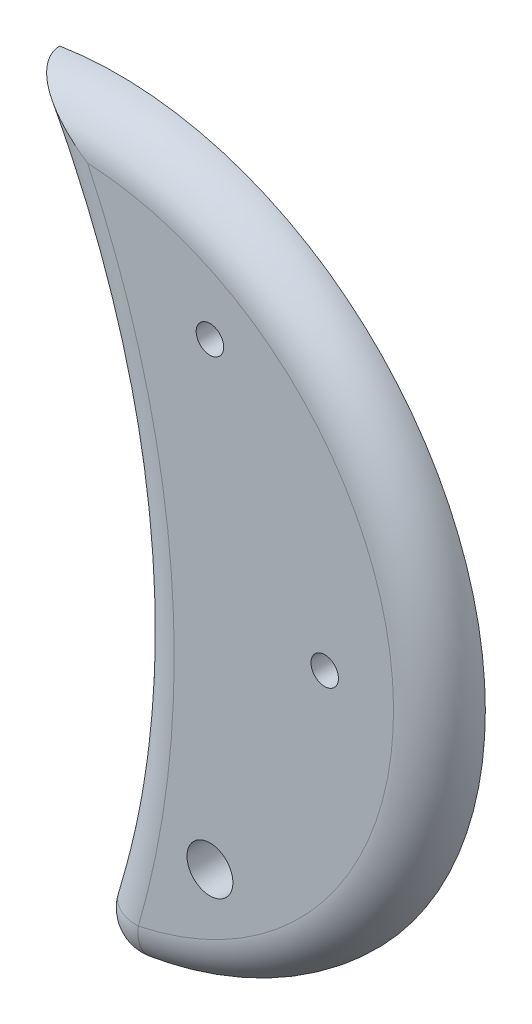
ISO-10303-21;
HEADER;
FILE_DESCRIPTION(('STEP AP214'),'2;1');
FILE_NAME('part.step','',(''),(''),'','','');
FILE_SCHEMA(('AUTOMOTIVE_DESIGN { 1 0 10303 214 1 1 1 1 }'));
ENDSEC;
DATA;
#1=APPLICATION_CONTEXT('core data for automotive mechanical design processes');
#2=APPLICATION_PROTOCOL_DEFINITION('international standard','automotive_design',2000,#1);
#3=PRODUCT_CONTEXT('',#1,'mechanical');
#4=PRODUCT('Part','Part','',(#3));
#5=PRODUCT_RELATED_PRODUCT_CATEGORY('part','',(#4));
#6=PRODUCT_DEFINITION_FORMATION('','',#4);
#7=PRODUCT_DEFINITION_CONTEXT('part definition',#1,'design');
#8=PRODUCT_DEFINITION('design','',#6,#7);
#9=PRODUCT_DEFINITION_SHAPE('','',#8);
#10=(LENGTH_UNIT() NAMED_UNIT(*) SI_UNIT(.MILLI.,.METRE.));
#11=(NAMED_UNIT(*) PLANE_ANGLE_UNIT() SI_UNIT($,.RADIAN.));
#12=(NAMED_UNIT(*) SI_UNIT($,.STERADIAN.) SOLID_ANGLE_UNIT());
#13=UNCERTAINTY_MEASURE_WITH_UNIT(LENGTH_MEASURE(1.E-05),#10,'distance_accuracy_value','');
#14=(GEOMETRIC_REPRESENTATION_CONTEXT(3) GLOBAL_UNCERTAINTY_ASSIGNED_CONTEXT((#13)) GLOBAL_UNIT_ASSIGNED_CONTEXT((#10,
#11,#12)) REPRESENTATION_CONTEXT('',''));
#15=CARTESIAN_POINT('',(0.,0.,0.));
#16=DIRECTION('',(0.,0.,1.));
#17=DIRECTION('',(1.,0.,0.));
#18=AXIS2_PLACEMENT_3D('',#15,#16,#17);
#19=CARTESIAN_POINT('',(0.,0.,5.));
#20=DIRECTION('',(0.,0.,1.));
#21=DIRECTION('',(1.,0.,0.));
#22=AXIS2_PLACEMENT_3D('',#19,#20,#21);
#23=PLANE('',#22);
#24=CARTESIAN_POINT('',(-86.5413482702245,-6.91231837330547,5.));
#25=DIRECTION('',(0.,0.,1.));
#26=DIRECTION('',(1.,0.,0.));
#27=AXIS2_PLACEMENT_3D('',#24,#25,#26);
#28=CIRCLE('',#27,97.6509559360171);
#29=CARTESIAN_POINT('',(1.67675560083044,34.9598125088663,5.));
#30=VERTEX_POINT('',#29);
#31=CARTESIAN_POINT('',(7.20478527755885,-34.2504170646763,5.));
#32=VERTEX_POINT('',#31);
#33=EDGE_CURVE('E51',#30,#32,#28,.F.);
#34=ORIENTED_EDGE('',*,*,#33,.T.);
#35=CARTESIAN_POINT('',(0.,0.,5.));
#36=DIRECTION('',(0.,0.,1.));
#37=DIRECTION('',(1.,0.,0.));
#38=AXIS2_PLACEMENT_3D('',#35,#36,#37);
#39=CIRCLE('',#38,35.);
#40=EDGE_CURVE('E11',#32,#30,#39,.T.);
#41=ORIENTED_EDGE('',*,*,#40,.T.);
#42=EDGE_LOOP('',(#34,#41));
#43=FACE_BOUND('',#42,.T.);
#44=CARTESIAN_POINT('',(15.,-25.,5.));
#45=DIRECTION('',(0.,0.,1.));
#46=DIRECTION('',(1.,0.,0.));
#47=AXIS2_PLACEMENT_3D('',#44,#45,#46);
#48=CIRCLE('',#47,2.5);
#49=CARTESIAN_POINT('',(17.5,-25.,5.));
#50=VERTEX_POINT('',#49);
#51=EDGE_CURVE('E159',#50,#50,#48,.T.);
#52=ORIENTED_EDGE('',*,*,#51,.F.);
#53=EDGE_LOOP('',(#52));
#54=FACE_BOUND('',#53,.T.);
#55=CARTESIAN_POINT('',(27.5,0.,5.));
#56=DIRECTION('',(0.,0.,1.));
#57=DIRECTION('',(1.,0.,0.));
#58=AXIS2_PLACEMENT_3D('',#55,#56,#57);
#59=CIRCLE('',#58,1.5);
#60=CARTESIAN_POINT('',(29.,0.,5.));
#61=VERTEX_POINT('',#60);
#62=EDGE_CURVE('E149',#61,#61,#59,.T.);
#63=ORIENTED_EDGE('',*,*,#62,.F.);
#64=EDGE_LOOP('',(#63));
#65=FACE_BOUND('',#64,.T.);
#66=CARTESIAN_POINT('',(15.,25.,5.));
#67=DIRECTION('',(0.,0.,1.));
#68=DIRECTION('',(1.,0.,0.));
#69=AXIS2_PLACEMENT_3D('',#66,#67,#68);
#70=CIRCLE('',#69,1.5);
#71=CARTESIAN_POINT('',(16.5,25.,5.));
#72=VERTEX_POINT('',#71);
#73=EDGE_CURVE('E163',#72,#72,#70,.T.);
#74=ORIENTED_EDGE('',*,*,#73,.F.);
#75=EDGE_LOOP('',(#74));
#76=FACE_BOUND('',#75,.T.);
#77=ADVANCED_FACE('F36',(#43,#54,#65,#76),#23,.T.);
#78=CARTESIAN_POINT('',(0.,0.,0.));
#79=DIRECTION('',(0.,0.,1.));
#80=DIRECTION('',(1.,0.,0.));
#81=AXIS2_PLACEMENT_3D('',#78,#79,#80);
#82=PLANE('',#81);
#83=CARTESIAN_POINT('',(15.,-25.,0.));
#84=DIRECTION('',(0.,0.,1.));
#85=DIRECTION('',(1.,0.,0.));
#86=AXIS2_PLACEMENT_3D('',#83,#84,#85);
#87=CIRCLE('',#86,2.5);
#88=CARTESIAN_POINT('',(17.5,-25.,0.));
#89=VERTEX_POINT('',#88);
#90=EDGE_CURVE('E87',#89,#89,#87,.T.);
#91=ORIENTED_EDGE('',*,*,#90,.T.);
#92=EDGE_LOOP('',(#91));
#93=FACE_BOUND('',#92,.T.);
#94=CARTESIAN_POINT('',(27.5,0.,0.));
#95=DIRECTION('',(0.,0.,1.));
#96=DIRECTION('',(1.,0.,0.));
#97=AXIS2_PLACEMENT_3D('',#94,#95,#96);
#98=CIRCLE('',#97,1.5);
#99=CARTESIAN_POINT('',(29.,0.,0.));
#100=VERTEX_POINT('',#99);
#101=EDGE_CURVE('E152',#100,#100,#98,.T.);
#102=ORIENTED_EDGE('',*,*,#101,.T.);
#103=EDGE_LOOP('',(#102));
#104=FACE_BOUND('',#103,.T.);
#105=CARTESIAN_POINT('',(15.,25.,0.));
#106=DIRECTION('',(0.,0.,1.));
#107=DIRECTION('',(1.,0.,0.));
#108=AXIS2_PLACEMENT_3D('',#105,#106,#107);
#109=CIRCLE('',#108,1.5);
#110=CARTESIAN_POINT('',(16.5,25.,0.));
#111=VERTEX_POINT('',#110);
#112=EDGE_CURVE('E154',#111,#111,#109,.T.);
#113=ORIENTED_EDGE('',*,*,#112,.T.);
#114=EDGE_LOOP('',(#113));
#115=FACE_BOUND('',#114,.T.);
#116=CARTESIAN_POINT('',(0.,0.,0.));
#117=DIRECTION('',(0.,0.,1.));
#118=DIRECTION('',(1.,0.,0.));
#119=AXIS2_PLACEMENT_3D('',#116,#117,#118);
#120=CIRCLE('',#119,40.);
#121=CARTESIAN_POINT('',(6.41610377327695,-39.4820669718613,0.));
#122=VERTEX_POINT('',#121);
#123=CARTESIAN_POINT('',(-6.34933432901625,39.4928595264812,0.));
#124=VERTEX_POINT('',#123);
#125=EDGE_CURVE('E78',#122,#124,#120,.T.);
#126=ORIENTED_EDGE('',*,*,#125,.F.);
#127=CARTESIAN_POINT('',(5.77449339594926,-35.5338602746752,0.));
#128=DIRECTION('',(0.,0.,1.));
#129=DIRECTION('',(1.,0.,0.));
#130=AXIS2_PLACEMENT_3D('',#127,#128,#129);
#131=CIRCLE('',#130,4.);
#132=CARTESIAN_POINT('',(1.95390659379546,-34.3493280939354,0.));
#133=VERTEX_POINT('',#132);
#134=EDGE_CURVE('E80',#122,#133,#131,.F.);
#135=ORIENTED_EDGE('',*,*,#134,.T.);
#136=CARTESIAN_POINT('',(-86.5413482702245,-6.91231837330547,0.));
#137=DIRECTION('',(0.,0.,1.));
#138=DIRECTION('',(1.,0.,0.));
#139=AXIS2_PLACEMENT_3D('',#136,#137,#138);
#140=CIRCLE('',#139,92.6509559360171);
#141=EDGE_CURVE('E76',#124,#133,#140,.F.);
#142=ORIENTED_EDGE('',*,*,#141,.F.);
#143=EDGE_LOOP('',(#126,#135,#142));
#144=FACE_BOUND('',#143,.T.);
#145=ADVANCED_FACE('F77',(#93,#104,#115,#144),#82,.F.);
#146=CARTESIAN_POINT('',(15.,25.,-5.));
#147=DIRECTION('',(0.,0.,1.));
#148=DIRECTION('',(1.,0.,0.));
#149=AXIS2_PLACEMENT_3D('',#146,#147,#148);
#150=CYLINDRICAL_SURFACE('',#149,1.5);
#151=ORIENTED_EDGE('',*,*,#73,.T.);
#152=EDGE_LOOP('',(#151));
#153=FACE_BOUND('',#152,.T.);
#154=ORIENTED_EDGE('',*,*,#112,.F.);
#155=EDGE_LOOP('',(#154));
#156=FACE_BOUND('',#155,.T.);
#157=ADVANCED_FACE('F135',(#153,#156),#150,.F.);
#158=CARTESIAN_POINT('',(27.5,0.,-5.));
#159=DIRECTION('',(0.,0.,1.));
#160=DIRECTION('',(1.,0.,0.));
#161=AXIS2_PLACEMENT_3D('',#158,#159,#160);
#162=CYLINDRICAL_SURFACE('',#161,1.5);
#163=ORIENTED_EDGE('',*,*,#62,.T.);
#164=EDGE_LOOP('',(#163));
#165=FACE_BOUND('',#164,.T.);
#166=ORIENTED_EDGE('',*,*,#101,.F.);
#167=EDGE_LOOP('',(#166));
#168=FACE_BOUND('',#167,.T.);
#169=ADVANCED_FACE('F127',(#165,#168),#162,.F.);
#170=CARTESIAN_POINT('',(15.,-25.,-5.));
#171=DIRECTION('',(0.,0.,1.));
#172=DIRECTION('',(1.,0.,0.));
#173=AXIS2_PLACEMENT_3D('',#170,#171,#172);
#174=CYLINDRICAL_SURFACE('',#173,2.5);
#175=ORIENTED_EDGE('',*,*,#51,.T.);
#176=EDGE_LOOP('',(#175));
#177=FACE_BOUND('',#176,.T.);
#178=ORIENTED_EDGE('',*,*,#90,.F.);
#179=EDGE_LOOP('',(#178));
#180=FACE_BOUND('',#179,.T.);
#181=ADVANCED_FACE('F114',(#177,#180),#174,.F.);
#182=CARTESIAN_POINT('',(6.48958614905013,-39.0802070353162,-1.92311896426616));
#183=CARTESIAN_POINT('',(4.80030164865467,-38.9609920255356,-2.86949739721329));
#184=CARTESIAN_POINT('',(3.52402928608467,-37.4999460520218,-2.86949739721328));
#185=CARTESIAN_POINT('',(2.24775692351467,-36.038900078508,-2.86949739721327));
#186=CARTESIAN_POINT('',(2.35664806806589,-34.3489186997729,-1.92311896426613));
#187=CARTESIAN_POINT('',(6.48418936039146,-39.1101514061324,-1.85434622883981));
#188=CARTESIAN_POINT('',(4.76577888793654,-39.0160738843651,-2.79136217502947));
#189=CARTESIAN_POINT('',(3.47714822735581,-37.5401622351441,-2.79151749002243));
#190=CARTESIAN_POINT('',(2.18832253769864,-36.0644178249756,-2.79136217502858));
#191=CARTESIAN_POINT('',(2.32663562653816,-34.3489931428829,-1.85434622883806));
#192=CARTESIAN_POINT('',(6.47898079018251,-39.1389523206582,-1.78386813534301));
#193=CARTESIAN_POINT('',(4.73109222325821,-39.0707979980772,-2.70853728193385));
#194=CARTESIAN_POINT('',(3.43023564472893,-37.5803927836842,-2.70870136824652));
#195=CARTESIAN_POINT('',(2.1292040465584,-36.0901376083289,-2.70853728193363));
#196=CARTESIAN_POINT('',(2.29776979987376,-34.3490547731885,-1.78386813534259));
#197=CARTESIAN_POINT('',(6.46900989435101,-39.1939308275111,-1.63946073346727));
#198=CARTESIAN_POINT('',(4.66207212118049,-39.1785882069103,-2.53218633923616));
#199=CARTESIAN_POINT('',(3.33743648716684,-37.6599546434117,-2.53234734291392));
#200=CARTESIAN_POINT('',(2.01263375360876,-36.1414643586849,-2.53218633923707));
#201=CARTESIAN_POINT('',(2.24266824898454,-34.3491566928876,-1.63946073346907));
#202=CARTESIAN_POINT('',(6.46424816113543,-39.2201049403855,-1.5655270328424));
#203=CARTESIAN_POINT('',(4.62774669182201,-39.2316362434194,-2.43862251838128));
#204=CARTESIAN_POINT('',(3.29155133403089,-37.6992847099872,-2.43879556134218));
#205=CARTESIAN_POINT('',(1.95520084713225,-36.167066122581,-2.43862251838265));
#206=CARTESIAN_POINT('',(2.216436013189,-34.3491969542707,-1.56552703284508));
#207=CARTESIAN_POINT('',(6.45521466748728,-39.2696357449745,-1.41366563457749));
#208=CARTESIAN_POINT('',(4.56009014684457,-39.3351721192653,-2.23904586927573));
#209=CARTESIAN_POINT('',(3.20162059657604,-37.7763536542176,-2.23922307694479));
#210=CARTESIAN_POINT('',(1.84299050734703,-36.2176727646773,-2.23904586927436));
#211=CARTESIAN_POINT('',(2.1667958957537,-34.3492605338924,-1.41366563457482));
#212=CARTESIAN_POINT('',(6.45094771855427,-39.2929648681452,-1.33570790544628));
#213=CARTESIAN_POINT('',(4.52678555585189,-39.3856062254289,-2.13291664146188));
#214=CARTESIAN_POINT('',(3.15759535937908,-37.814074961345,-2.13309743108981));
#215=CARTESIAN_POINT('',(1.78826980046049,-36.2426596609134,-2.13291664145728));
#216=CARTESIAN_POINT('',(2.14341564998502,-34.3492836958892,-1.33570790543734));
#217=CARTESIAN_POINT('',(6.44304178197689,-39.3360978073095,-1.17664702060251));
#218=CARTESIAN_POINT('',(4.46284150168766,-39.4815785277273,-1.90847082565426));
#219=CARTESIAN_POINT('',(3.07350931529173,-37.886111047623,-1.90865119569096));
#220=CARTESIAN_POINT('',(1.68404188293693,-36.2907594327121,-1.9084708256589));
#221=CARTESIAN_POINT('',(2.1001886841293,-34.3493171263842,-1.17664702061148));
#222=CARTESIAN_POINT('',(6.43940254771849,-39.3559030078647,-1.09554511556941));
#223=CARTESIAN_POINT('',(4.43222176438166,-39.5270845805024,-1.7901624666426));
#224=CARTESIAN_POINT('',(3.03344695413296,-37.9204271623314,-1.79033542467091));
#225=CARTESIAN_POINT('',(1.63456928735269,-36.3138578404022,-1.79016246665976));
#226=CARTESIAN_POINT('',(2.08034057625232,-34.349327399956,-1.09554511560256));
#227=CARTESIAN_POINT('',(6.43290959103064,-39.3911784973452,-0.932340848062717));
#228=CARTESIAN_POINT('',(4.37587829536829,-39.6101915849686,-1.54437934354097));
#229=CARTESIAN_POINT('',(2.96006159851482,-37.9832809470199,-1.54454495197855));
#230=CARTESIAN_POINT('',(1.54414559571374,-36.3564553628789,-1.54437934352414));
#231=CARTESIAN_POINT('',(2.0449889808156,-34.349339536838,-0.932340848030281));
#232=CARTESIAN_POINT('',(6.4300402174895,-39.4067352954568,-0.85030071254826));
#233=CARTESIAN_POINT('',(4.35008424096242,-39.647909467721,-1.41718754498305));
#234=CARTESIAN_POINT('',(2.92660868428745,-38.0119300291435,-1.41733203507037));
#235=CARTESIAN_POINT('',(1.50306881121112,-36.3760056684722,-1.41718754492086));
#236=CARTESIAN_POINT('',(2.02939878960407,-34.3493415818732,-0.850300712428563));
#237=CARTESIAN_POINT('',(6.42505839601453,-39.4337121619113,-0.683980523650601));
#238=CARTESIAN_POINT('',(4.30422298692116,-39.714594340973,-1.15265062812626));
#239=CARTESIAN_POINT('',(2.86734489681844,-38.062680754996,-1.15279532295739));
#240=CARTESIAN_POINT('',(1.43040155078398,-36.410823050776,-1.15265062818875));
#241=CARTESIAN_POINT('',(2.00236418826442,-34.3493417385894,-0.683980523770599));
#242=CARTESIAN_POINT('',(6.42294599349229,-39.4451319820723,-0.599700336209669));
#243=CARTESIAN_POINT('',(4.28418261908045,-39.7435213627055,-1.01536306529238));
#244=CARTESIAN_POINT('',(2.8415344820757,-38.0847820058989,-1.01547092174799));
#245=CARTESIAN_POINT('',(1.39885451754051,-36.4260699023501,-1.01536306552536));
#246=CARTESIAN_POINT('',(1.99092002686117,-34.3493398500346,-0.599700336656648));
#247=CARTESIAN_POINT('',(6.41954887555115,-39.463483428009,-0.429921464599631));
#248=CARTESIAN_POINT('',(4.25145089265275,-39.7906007267776,-0.733699096094957));
#249=CARTESIAN_POINT('',(2.79948741583657,-38.1207855342151,-0.733806661655461));
#250=CARTESIAN_POINT('',(1.34749145098076,-36.4509981597162,-0.733699096327442));
#251=CARTESIAN_POINT('',(1.97252953592976,-34.3493354026827,-0.429921465044994));
#252=CARTESIAN_POINT('',(6.4182605025726,-39.4704348878678,-0.344429911119523));
#253=CARTESIAN_POINT('',(4.23874956831541,-39.8087680041502,-0.589443782056997));
#254=CARTESIAN_POINT('',(2.78320848526449,-38.1347240194963,-0.589500905794403));
#255=CARTESIAN_POINT('',(1.32765919446256,-36.4606870626812,-0.589443782119512));
#256=CARTESIAN_POINT('',(1.96556332972516,-34.3493328469195,-0.344429911239211));
#257=CARTESIAN_POINT('',(6.41653803683645,-39.4797262126457,-0.172623786179154));
#258=CARTESIAN_POINT('',(4.22166973430663,-39.8331690068774,-0.296735572159069));
#259=CARTESIAN_POINT('',(2.76134861772367,-38.1534409028592,-0.296793785543955));
#260=CARTESIAN_POINT('',(1.3010184815269,-36.4737205214381,-0.296735572096761));
#261=CARTESIAN_POINT('',(1.9562523066927,-34.3493291940552,-0.172623786059956));
#262=CARTESIAN_POINT('',(6.41610384566939,-39.482066608801,-0.086309310678426));
#263=CARTESIAN_POINT('',(4.2173034535917,-39.839385232317,-0.148393409698378));
#264=CARTESIAN_POINT('',(2.75576644839331,-38.1582203561424,-0.14839289494892));
#265=CARTESIAN_POINT('',(1.29422912786404,-36.4770557499491,-0.148393409681407));
#266=CARTESIAN_POINT('',(1.95390695750032,-34.3493280967861,-0.0863093106459681));
#267=CARTESIAN_POINT('',(6.41610370725549,-39.4820673029701,0.0787135613923312));
#268=CARTESIAN_POINT('',(4.21730034574979,-39.8393890080294,0.13533389305595));
#269=CARTESIAN_POINT('',(2.75576249271669,-38.158223739614,0.135333409048617));
#270=CARTESIAN_POINT('',(1.29422492726304,-36.4770582249775,0.135333893040473));
#271=CARTESIAN_POINT('',(1.95390626209887,-34.3493280913355,0.0787135613627298));
#272=CARTESIAN_POINT('',(6.41646471205821,-39.4801213517996,0.157422827032545));
#273=CARTESIAN_POINT('',(4.22092921437135,-39.8342220364355,0.270615953944064));
#274=CARTESIAN_POINT('',(2.76040175849405,-38.1542515972551,0.2706601678561));
#275=CARTESIAN_POINT('',(1.29986821719414,-36.4742863684361,0.270615953936716));
#276=CARTESIAN_POINT('',(1.955856331749,-34.3493289989992,0.157422827018491));
#277=CARTESIAN_POINT('',(6.41789843033447,-39.4723882601357,0.31420757484439));
#278=CARTESIAN_POINT('',(4.23517065993787,-39.8138844753205,0.538141601276563));
#279=CARTESIAN_POINT('',(2.77862502314679,-38.1386484968892,0.538185214812272));
#280=CARTESIAN_POINT('',(1.32207350647716,-36.4634175530113,0.538141601283966));
#281=CARTESIAN_POINT('',(1.96360581475521,-34.3493321078432,0.314207574858558));
#282=CARTESIAN_POINT('',(6.41897109069538,-39.4666014062986,0.392283103873234));
#283=CARTESIAN_POINT('',(4.24577352560451,-39.7987277763179,0.670300823201733));
#284=CARTESIAN_POINT('',(2.79220835450359,-38.1270181104367,0.670383735666698));
#285=CARTESIAN_POINT('',(1.33862034228895,-36.4553280021393,0.670300823215754));
#286=CARTESIAN_POINT('',(1.96940494084657,-34.3493343089268,0.392283103900078));
#287=CARTESIAN_POINT('',(6.4218016089132,-39.4513157576454,0.547344820257578));
#288=CARTESIAN_POINT('',(4.27322029689403,-39.7593094015378,0.929066102220351));
#289=CARTESIAN_POINT('',(2.82743743536138,-38.0968529768457,0.929148676145166));
#290=CARTESIAN_POINT('',(1.38163235534176,-36.434415577151,0.929066102232271));
#291=CARTESIAN_POINT('',(1.98472308574727,-34.3493385291073,0.547344820280427));
#292=CARTESIAN_POINT('',(6.42356055109671,-39.4418110886136,0.624329082934972));
#293=CARTESIAN_POINT('',(4.29005791274108,-39.7350567155794,1.05559314381347));
#294=CARTESIAN_POINT('',(2.84909594123686,-38.0783073056089,1.05570582804859));
#295=CARTESIAN_POINT('',(1.4080877180778,-36.4215975020849,1.05559314381667));
#296=CARTESIAN_POINT('',(1.99424799135645,-34.3493405479098,0.624329082941104));
#297=CARTESIAN_POINT('',(6.42771936268219,-39.4193072896775,0.776587528625169));
#298=CARTESIAN_POINT('',(4.32886839986547,-39.678808192773,1.30083171866559));
#299=CARTESIAN_POINT('',(2.89915908498271,-38.0354369448474,1.30094456712884));
#300=CARTESIAN_POINT('',(1.4694039406493,-36.3921049419,1.30083171866246));
#301=CARTESIAN_POINT('',(2.01679986614531,-34.3493421111285,0.776587528619152));
#302=CARTESIAN_POINT('',(6.43011931682011,-39.4063076977746,0.851861484122439));
#303=CARTESIAN_POINT('',(4.35082234700842,-39.6468402950387,1.41949227994091));
#304=CARTESIAN_POINT('',(2.92756461469322,-38.011111491335,1.4196251104983));
#305=CARTESIAN_POINT('',(1.50423440430149,-36.375444759195,1.41949227994016));
#306=CARTESIAN_POINT('',(2.02982729832863,-34.3493416552173,0.851861484120994));
#307=CARTESIAN_POINT('',(6.43609041264969,-39.3739086532159,1.01640394858251));
#308=CARTESIAN_POINT('',(4.4037981649971,-39.5691252774524,1.67241320513507));
#309=CARTESIAN_POINT('',(2.99637229098416,-37.9521822542983,1.67260784141204));
#310=CARTESIAN_POINT('',(1.58884080994378,-36.335329677969,1.67241320513597));
#311=CARTESIAN_POINT('',(2.06229602501097,-34.3493347455446,1.01640394858423));
#312=CARTESIAN_POINT('',(6.43980267337465,-39.3537326692884,1.10516717486686));
#313=CARTESIAN_POINT('',(4.43573814720682,-39.5219185393065,1.80450596729511));
#314=CARTESIAN_POINT('',(3.03804015887209,-37.9164934978908,1.80471613325523));
#315=CARTESIAN_POINT('',(1.64019264533106,-36.3111965445313,1.80450596729451));
#316=CARTESIAN_POINT('',(2.08251557789481,-34.3493270124869,1.10516717486566));
#317=CARTESIAN_POINT('',(6.4479878921997,-39.309129619237,1.27907212967272));
#318=CARTESIAN_POINT('',(4.50324887275082,-39.4210852952088,2.05438784736548));
#319=CARTESIAN_POINT('',(3.12657714489054,-37.8406498131244,2.05459883615981));
#320=CARTESIAN_POINT('',(1.74975649815144,-36.2603418999706,2.05438784736628));
#321=CARTESIAN_POINT('',(2.12721557167296,-34.3492979264669,1.27907212967431));
#322=CARTESIAN_POINT('',(6.45246101125305,-39.284701653616,1.36421308715942));
#323=CARTESIAN_POINT('',(4.53879188313858,-39.3675033498398,2.17216166857275));
#324=CARTESIAN_POINT('',(3.17344736280462,-37.8004939404073,2.17237020530137));
#325=CARTESIAN_POINT('',(1.80792046022515,-36.2336408179529,2.17216166857644));
#326=CARTESIAN_POINT('',(2.15169691413924,-34.3492765706202,1.36421308716673));
#327=CARTESIAN_POINT('',(6.46206234636244,-39.2321088442839,1.53065706152158));
#328=CARTESIAN_POINT('',(4.61175844450836,-39.2562567844639,2.3938680584292));
#329=CARTESIAN_POINT('',(3.27023776531203,-37.717552173451,2.3940767787314));
#330=CARTESIAN_POINT('',(1.92853514383127,-36.1790034729447,2.39386805843194));
#331=CARTESIAN_POINT('',(2.20440551310883,-34.34921430184,1.53065706152697));
#332=CARTESIAN_POINT('',(6.46719113620572,-39.203940726666,1.61195663035726));
#333=CARTESIAN_POINT('',(4.64916460068194,-39.1986221793965,2.49780398948394));
#334=CARTESIAN_POINT('',(3.32016060109111,-37.6747639928611,2.49799969937483));
#335=CARTESIAN_POINT('',(1.99095372450778,-36.1510797379485,2.49780398948286));
#336=CARTESIAN_POINT('',(2.23263605143966,-34.3491733716897,1.611956630355));
#337=CARTESIAN_POINT('',(6.47799898585793,-39.1443802304753,1.77054605163431));
#338=CARTESIAN_POINT('',(4.72452265649421,-39.0811544674424,2.69282363225831));
#339=CARTESIAN_POINT('',(3.42137058787111,-37.5879950103361,2.69301943018727));
#340=CARTESIAN_POINT('',(2.11801503316359,-36.0950100033482,2.69282363225939));
#341=CARTESIAN_POINT('',(2.29232966185308,-34.349066287172,1.7705460516366));
#342=CARTESIAN_POINT('',(6.48367824146472,-39.1129867044012,1.8478344622071));
#343=CARTESIAN_POINT('',(4.76246488005734,-39.0213413557535,2.78393429171981));
#344=CARTESIAN_POINT('',(3.47265821958245,-37.5440137880776,2.78411164806859));
#345=CARTESIAN_POINT('',(2.18263669386205,-36.0668705333231,2.78393429172685));
#346=CARTESIAN_POINT('',(2.32379388438248,-34.3490001238045,1.84783446222161));
#347=CARTESIAN_POINT('',(6.49850477563895,-39.0307225733391,2.03676907677782));
#348=CARTESIAN_POINT('',(4.85712406419881,-38.8703607468461,2.99799416149406));
#349=CARTESIAN_POINT('',(3.60157947673666,-37.4334210299536,2.99839643661414));
#350=CARTESIAN_POINT('',(2.34555303261243,-35.9968946730418,2.99799416148345));
#351=CARTESIAN_POINT('',(2.40624501790251,-34.3487957813753,2.03676907675582));
#352=CARTESIAN_POINT('',(6.50794448118974,-38.9780792060003,2.14585244740282));
#353=CARTESIAN_POINT('',(4.91369925224531,-38.7785351376566,3.11395842012103));
#354=CARTESIAN_POINT('',(3.67931980838145,-37.3666988500916,3.11429090538413));
#355=CARTESIAN_POINT('',(2.44445737713807,-35.955277390304,3.11395842007046));
#356=CARTESIAN_POINT('',(2.45900957433365,-34.3486380851854,2.14585244729785));
#357=CARTESIAN_POINT('',(6.52759491883519,-38.8677912556215,2.35521773583202));
#358=CARTESIAN_POINT('',(5.02430592028015,-38.5959342021936,3.32474797716011));
#359=CARTESIAN_POINT('',(3.8327857666768,-37.2348939907656,3.32508073060424));
#360=CARTESIAN_POINT('',(2.64077995028856,-35.8742708807436,3.32474797721228));
#361=CARTESIAN_POINT('',(2.56955556571068,-34.3482375390444,2.35521773594098));
#362=CARTESIAN_POINT('',(6.53780605741751,-38.8101440335066,2.45549495242192));
#363=CARTESIAN_POINT('',(5.07835339718323,-38.5051505683078,3.4196974067737));
#364=CARTESIAN_POINT('',(3.90851030233175,-37.169812200092,3.41996491122501));
#365=CARTESIAN_POINT('',(2.738209162378,-35.834867839468,3.41969740696751));
#366=CARTESIAN_POINT('',(2.62733964800891,-34.3479946439508,2.45549495282798));
#367=CARTESIAN_POINT('',(6.55880152536649,-38.6907925913871,2.64791376288563));
#368=CARTESIAN_POINT('',(5.18338919462322,-38.3259254044872,3.59296793454553));
#369=CARTESIAN_POINT('',(4.05703859311677,-37.0420502884039,3.59323447554175));
#370=CARTESIAN_POINT('',(2.93023046212521,-35.7585687289126,3.59296793473837));
#371=CARTESIAN_POINT('',(2.74697948316797,-34.3474106261679,2.64791376329214));
#372=CARTESIAN_POINT('',(6.56958675461915,-38.629081963842,2.7400419434069));
#373=CARTESIAN_POINT('',(5.23440129162747,-38.2374563369524,3.67138070599243));
#374=CARTESIAN_POINT('',(4.12983742889897,-36.9793742197784,3.67159294082083));
#375=CARTESIAN_POINT('',(3.02485353800221,-35.7216540985215,3.67138070604394));
#376=CARTESIAN_POINT('',(2.80884166693013,-34.3470693453273,2.74004194351579));
#377=CARTESIAN_POINT('',(6.59155296696068,-38.502465843155,2.91661025069219));
#378=CARTESIAN_POINT('',(5.33324855058634,-38.0635593608125,3.81496529858352));
#379=CARTESIAN_POINT('',(4.27211276907215,-36.8567576242854,3.81517641450372));
#380=CARTESIAN_POINT('',(3.21055803137228,-35.6503169504451,3.81496529853456));
#381=CARTESIAN_POINT('',(2.93577467237489,-34.3462784225577,2.91661025058815));
#382=CARTESIAN_POINT('',(6.60273409115863,-38.4375592075713,3.00104759710847));
#383=CARTESIAN_POINT('',(5.38111441274269,-37.9780914733077,3.88022921658439));
#384=CARTESIAN_POINT('',(4.34158806768072,-36.7968180905897,3.88039668350253));
#385=CARTESIAN_POINT('',(3.30168376132801,-35.6158711789512,3.88022921657526));
#386=CARTESIAN_POINT('',(3.00084664143894,-34.3458287416529,3.00104759708923));
#387=CARTESIAN_POINT('',(6.6240334314104,-38.3129492159838,3.15330403275097));
#388=CARTESIAN_POINT('',(5.46846156084482,-37.8201196177214,3.99323493557789));
#389=CARTESIAN_POINT('',(4.46931416747152,-36.6864932799778,3.99336439387229));
#390=CARTESIAN_POINT('',(3.46987339165103,-35.5531203519772,3.9932349355859));
#391=CARTESIAN_POINT('',(3.1257804294343,-34.3448725534114,3.15330403276795));
#392=CARTESIAN_POINT('',(6.63412263432566,-38.2535276074494,3.22191095601613));
#393=CARTESIAN_POINT('',(5.50826565580273,-37.7472835150947,4.04215793851123));
#394=CARTESIAN_POINT('',(4.52792616569305,-36.6358115750925,4.04226380084711));
#395=CARTESIAN_POINT('',(3.54732058367055,-35.5245699832954,4.04215793850359));
#396=CARTESIAN_POINT('',(3.18535903505225,-34.3443788832772,3.221910955999));
#397=CARTESIAN_POINT('',(6.65443802085581,-38.1330185018103,3.35394222719846));
#398=CARTESIAN_POINT('',(5.58577592791553,-37.6039971277715,4.13326407970828));
#399=CARTESIAN_POINT('',(4.64277057086959,-36.5363911821791,4.13336871522257));
#400=CARTESIAN_POINT('',(3.69950061344937,-35.4690143067768,4.13326407971637));
#401=CARTESIAN_POINT('',(3.30619238117052,-34.3432963861538,3.35394222721665));
#402=CARTESIAN_POINT('',(6.66466422626575,-38.0719307380047,3.41736573883793));
#403=CARTESIAN_POINT('',(5.62350156053795,-37.5335175044307,4.17548906423106));
#404=CARTESIAN_POINT('',(4.69900259314286,-36.4876528083298,4.17557314350288));
#405=CARTESIAN_POINT('',(3.77426541215143,-35.4419948704721,4.17548906427029));
#406=CARTESIAN_POINT('',(3.36744739001755,-34.3427075438551,3.41736573892557));
#407=CARTESIAN_POINT('',(6.69547062352286,-37.8865263784033,3.60043687337304));
#408=CARTESIAN_POINT('',(5.73366857348836,-37.3258242708481,4.29361041864259));
#409=CARTESIAN_POINT('',(4.86448539834979,-36.3440420309579,4.29395344740939));
#410=CARTESIAN_POINT('',(3.9943494438626,-35.3630865818232,4.29361041871901));
#411=CARTESIAN_POINT('',(3.55336898782907,-34.3407918342657,3.60043687354483));
#412=CARTESIAN_POINT('',(6.71617027607608,-37.76011728289,3.71282691354884));
#413=CARTESIAN_POINT('',(5.8036498483072,-37.1913503270288,4.36162690785541));
#414=CARTESIAN_POINT('',(4.9704739440384,-36.2518162718371,4.36185479158626));
#415=CARTESIAN_POINT('',(4.13652811372577,-35.3129540568196,4.3616269078826));
#416=CARTESIAN_POINT('',(3.68014345456419,-34.3393161466244,3.71282691361098));
#417=CARTESIAN_POINT('',(6.75758063997843,-37.5031421490593,3.92072103615075));
#418=CARTESIAN_POINT('',(5.93784214245505,-36.9297846515001,4.48191666701269));
#419=CARTESIAN_POINT('',(5.17559030727981,-36.072829255822,4.48213958442122));
#420=CARTESIAN_POINT('',(4.41257097383118,-35.2165435949634,4.48191666698565));
#421=CARTESIAN_POINT('',(3.93789180693354,-34.3359431800254,3.92072103608847));
#422=CARTESIAN_POINT('',(6.77829127472029,-37.3725675436186,4.016187262921));
#423=CARTESIAN_POINT('',(6.0021569599437,-36.8025109361924,4.53433860537172));
#424=CARTESIAN_POINT('',(5.27470244970183,-35.9860805221221,4.53448841711693));
#425=CARTESIAN_POINT('',(4.54662997573879,-35.1701926158479,4.5343386053394));
#426=CARTESIAN_POINT('',(4.06887435175225,-34.3340449768265,4.01618726284415));
#427=CARTESIAN_POINT('',(6.81944761789675,-37.1086393137928,4.19173009620827));
#428=CARTESIAN_POINT('',(6.12618560482165,-36.5541981667832,4.62730161543388));
#429=CARTESIAN_POINT('',(5.46727416779241,-35.817004597763,4.62744849653453));
#430=CARTESIAN_POINT('',(4.8077514825439,-35.0803477556027,4.62730161546397));
#431=CARTESIAN_POINT('',(4.33366199152587,-34.3298151723515,4.19173009628036));
#432=CARTESIAN_POINT('',(6.8398933810704,-36.9752862789575,4.27180993140587));
#433=CARTESIAN_POINT('',(6.18599234406043,-36.4329926003427,4.66796757213375));
#434=CARTESIAN_POINT('',(5.56073492652041,-35.7346764820996,4.66806220665787));
#435=CARTESIAN_POINT('',(4.93499197322372,-35.0367896875172,4.66796757223108));
#436=CARTESIAN_POINT('',(4.46746648776825,-34.3274836622029,4.27180993164144));
#437=CARTESIAN_POINT('',(6.89167054524039,-36.6314590190339,4.4589092352465));
#438=CARTESIAN_POINT('',(6.33428081592422,-36.1295685817146,4.76019501124442));
#439=CARTESIAN_POINT('',(5.79425701430221,-35.5282835790416,4.76043131926489));
#440=CARTESIAN_POINT('',(5.25304926786524,-34.92804467648,4.76019501109375));
#441=CARTESIAN_POINT('',(4.81250782091246,-34.3209497615481,4.45890923487936));
#442=CARTESIAN_POINT('',(6.9227001262333,-36.4195321905768,4.55597509779046));
#443=CARTESIAN_POINT('',(6.42068360765826,-35.9499693312189,4.80561386278052));
#444=CARTESIAN_POINT('',(5.93117312246523,-35.4066054723623,4.80572969931443));
#445=CARTESIAN_POINT('',(5.44085562816514,-34.8639625765506,4.80561386208428));
#446=CARTESIAN_POINT('',(5.02523015382125,-34.3164299773822,4.55597509608653));
#447=CARTESIAN_POINT('',(6.98331829942182,-35.992808101856,4.72012422703388));
#448=CARTESIAN_POINT('',(6.58754767252568,-35.5989522976124,4.88028519185489));
#449=CARTESIAN_POINT('',(6.19774586342245,-35.1683875567144,4.88039371903913));
#450=CARTESIAN_POINT('',(5.80714908246931,-34.7385334330086,4.88028519271407));
#451=CARTESIAN_POINT('',(5.45366722357053,-34.3062935838757,4.72012422914587));
#452=CARTESIAN_POINT('',(7.01290602649401,-35.778009214472,4.78718968591775));
#453=CARTESIAN_POINT('',(6.66821948660082,-35.4271148900358,4.90970469846684));
#454=CARTESIAN_POINT('',(6.32739814468011,-35.0518508364918,4.90974989785535));
#455=CARTESIAN_POINT('',(5.98607827714076,-34.6770374604604,4.90970470141441));
#456=CARTESIAN_POINT('',(5.669383659557,-34.3006763259245,4.7871896931863));
#457=CARTESIAN_POINT('',(7.07030973010163,-35.3474537175585,4.89363109446924));
#458=CARTESIAN_POINT('',(6.82524759438617,-35.0890162625063,4.95558480816911));
#459=CARTESIAN_POINT('',(6.58158761615728,-34.82204727408,4.95562908467508));
#460=CARTESIAN_POINT('',(6.33743474277977,-34.5555239158895,4.95558481103611));
#461=CARTESIAN_POINT('',(6.10190461033266,-34.2883579742329,4.89363110156758));
#462=CARTESIAN_POINT('',(7.09812884691581,-35.1316995769207,4.93305744286627));
#463=CARTESIAN_POINT('',(6.90178281931084,-34.9223909642364,4.97216437330293));
#464=CARTESIAN_POINT('',(6.70613372460343,-34.7087748433066,4.97217545659167));
#465=CARTESIAN_POINT('',(6.5102443992074,-34.4953784897874,4.97216437402514));
#466=CARTESIAN_POINT('',(6.31870641484077,-34.2816588807729,4.933057444657));
#467=CARTESIAN_POINT('',(7.15186585536998,-34.7000168699335,4.9858636369294));
#468=CARTESIAN_POINT('',(7.05197035144415,-34.5920052608562,4.99419524415178));
#469=CARTESIAN_POINT('',(6.95222078490142,-34.4836270855111,4.99420550427607));
#470=CARTESIAN_POINT('',(6.85223463357486,-34.3754653864191,4.99419524343498));
#471=CARTESIAN_POINT('',(6.75262590997948,-34.2671856493181,4.98586363514867));
#472=CARTESIAN_POINT('',(7.17778481902626,-34.4840884725111,4.99925827952504));
#473=CARTESIAN_POINT('',(7.12577213431263,-34.4279247328562,4.99969525296067));
#474=CARTESIAN_POINT('',(7.07376340517859,-34.3717510007353,4.99969546478828));
#475=CARTESIAN_POINT('',(7.02174823817793,-34.3155831768959,4.99969525294113));
#476=CARTESIAN_POINT('',(6.96974335091182,-34.2594121247444,4.99925827947647));
#477=CARTESIAN_POINT('',(7.20339096837491,-34.262502612167,4.99998999123971));
#478=CARTESIAN_POINT('',(7.20070039011853,-34.2595978379294,4.9999958708566));
#479=CARTESIAN_POINT('',(7.19800981636511,-34.2566930550031,4.99999586513824));
#480=CARTESIAN_POINT('',(7.19531924066314,-34.2537882753808,4.99999587085715));
#481=CARTESIAN_POINT('',(7.19262867358571,-34.2508834933568,4.99998999124107));
#482=CARTESIAN_POINT('',(7.20408852116256,-34.2564596809092,4.99999997706329));
#483=CARTESIAN_POINT('',(7.2027431635321,-34.2550073839402,4.9999999780029));
#484=CARTESIAN_POINT('',(7.20139780748663,-34.2535550849253,4.99999997194882));
#485=CARTESIAN_POINT('',(7.20005245465018,-34.2521027845237,4.99999997800346));
#486=CARTESIAN_POINT('',(7.1987071035704,-34.2506504842047,4.99999997706469));
#487=CARTESIAN_POINT('',(7.20478527755885,-34.2504170646763,5.));
#488=CARTESIAN_POINT('',(7.20478527755885,-34.2504170646763,5.));
#489=CARTESIAN_POINT('',(7.20478527755885,-34.2504170646763,5.));
#490=CARTESIAN_POINT('',(7.20478527755885,-34.2504170646763,5.));
#491=CARTESIAN_POINT('',(7.20478527755885,-34.2504170646763,5.));
#492=(BOUNDED_SURFACE() B_SPLINE_SURFACE(3,2,((#182,#183,#184,#185,#186),(#187,#188,#189,#190,
#191),(#192,#193,#194,#195,#196),(#197,#198,#199,#200,#201),(#202,#203,#204,#205,#206),(#207,
#208,#209,#210,#211),(#212,#213,#214,#215,#216),(#217,#218,#219,#220,#221),(#222,#223,#224,#225,
#226),(#227,#228,#229,#230,#231),(#232,#233,#234,#235,#236),(#237,#238,#239,#240,#241),(#242,
#243,#244,#245,#246),(#247,#248,#249,#250,#251),(#252,#253,#254,#255,#256),(#257,#258,#259,#260,
#261),(#262,#263,#264,#265,#266),(#267,#268,#269,#270,#271),(#272,#273,#274,#275,#276),(#277,
#278,#279,#280,#281),(#282,#283,#284,#285,#286),(#287,#288,#289,#290,#291),(#292,#293,#294,#295,
#296),(#297,#298,#299,#300,#301),(#302,#303,#304,#305,#306),(#307,#308,#309,#310,#311),(#312,
#313,#314,#315,#316),(#317,#318,#319,#320,#321),(#322,#323,#324,#325,#326),(#327,#328,#329,#330,
#331),(#332,#333,#334,#335,#336),(#337,#338,#339,#340,#341),(#342,#343,#344,#345,#346),(#347,
#348,#349,#350,#351),(#352,#353,#354,#355,#356),(#357,#358,#359,#360,#361),(#362,#363,#364,#365,
#366),(#367,#368,#369,#370,#371),(#372,#373,#374,#375,#376),(#377,#378,#379,#380,#381),(#382,
#383,#384,#385,#386),(#387,#388,#389,#390,#391),(#392,#393,#394,#395,#396),(#397,#398,#399,#400,
#401),(#402,#403,#404,#405,#406),(#407,#408,#409,#410,#411),(#412,#413,#414,#415,#416),(#417,
#418,#419,#420,#421),(#422,#423,#424,#425,#426),(#427,#428,#429,#430,#431),(#432,#433,#434,#435,
#436),(#437,#438,#439,#440,#441),(#442,#443,#444,#445,#446),(#447,#448,#449,#450,#451),(#452,
#453,#454,#455,#456),(#457,#458,#459,#460,#461),(#462,#463,#464,#465,#466),(#467,#468,#469,#470,
#471),(#472,#473,#474,#475,#476),(#477,#478,#479,#480,#481),(#482,#483,#484,#485,#486),(#487,
#488,#489,#490,#491)),.UNSPECIFIED.,.F.,.F.,.F.) B_SPLINE_SURFACE_WITH_KNOTS((4,2,2,2,2,2,2,2,2,
2,2,2,2,2,2,2,2,2,2,2,2,2,2,2,2,2,2,2,2,2,4),(3,2,3),(0.,0.0526593342819181,0.105387524975352,
0.158591738564364,0.211775001646139,0.263777058456713,0.315782234411396,0.367554946843858,
0.41932169424272,0.466532650018319,0.513740082718364,0.561022407285443,0.608310985241532,
0.665854915123244,0.723411033119594,0.781017868606117,0.838645270274915,0.925640076699683,
1.01268104698331,1.09986271988848,1.18707578616244,1.26406726610905,1.34107114323285,
1.49514228987659,1.64955383417331,1.80393294127799,2.04458390280423,2.28537752240193,
2.52573091500972,2.76594764605364,2.77268267599545),(0.,0.5,1.),
.UNSPECIFIED.) GEOMETRIC_REPRESENTATION_ITEM() RATIONAL_B_SPLINE_SURFACE(((1.,0.899762256609771,
1.,0.899762256609771,1.),(1.,0.898058930907588,1.,0.898058930907588,1.),(1.,0.896373009371966,
1.,0.896373009371966,1.),(1.,0.893074269131539,1.,0.893074269131539,1.),(1.,0.89146154889724,1.,
0.89146154889724,1.),(1.,0.888338136621876,1.,0.888338136621876,1.),(1.,0.886828497117821,1.,
0.886828497117821,1.),(1.,0.883979061331051,1.,0.883979061331051,1.),(1.,0.882639198402347,1.,
0.882639198402347,1.),(1.,0.880211193779915,1.,0.880211193779915,1.),(1.,0.879118122268959,1.,
0.879118122268959,1.),(1.,0.877198162688803,1.,0.877198162688803,1.),(1.,0.876371290589529,1.,
0.876371290589529,1.),(1.,0.87503178493484,1.,0.87503178493484,1.),(1.,0.874517763252507,1.,
0.874517763252507,1.),(1.,0.873828854071217,1.,0.873828854071217,1.),(1.,0.873653927505473,1.,
0.873653927505473,1.),(1.,0.873653833519279,1.,0.873653833519279,1.),(1.,0.87379923996686,1.,
0.87379923996686,1.),(1.,0.874373156838905,1.,0.874373156838905,1.),(1.,0.874801646136177,1.,
0.874801646136177,1.),(1.,0.875921275860719,1.,0.875921275860719,1.),(1.,0.876612831890424,1.,
0.876612831890424,1.),(1.,0.878226663014994,1.,0.878226663014994,1.),(1.,0.879148968611832,1.,
0.879148968611832,1.),(1.,0.881407679567161,1.,0.881407679567161,1.),(1.,0.882790512277338,1.,
0.882790512277338,1.),(1.,0.885771272327167,1.,0.885771272327167,1.),(1.,0.887369245162985,1.,
0.887369245162985,1.),(1.,0.890715643076858,1.,0.890715643076858,1.),(1.,0.892464199490117,1.,
0.892464199490117,1.),(1.,0.896054703861654,1.,0.896054703861654,1.),(1.,0.897896684938728,1.,
0.897896684938728,1.),(1.,0.902578539171437,1.,0.902578539171437,1.),(1.,0.905448582747075,1.,
0.905448582747075,1.),(1.,0.91118174986114,1.,0.91118174986114,1.),(1.,0.914044868919267,1.,
0.914044868919267,1.),(1.,0.919696728112145,1.,0.919696728112145,1.),(1.,0.92248534053097,1.,
0.92248534053097,1.),(1.,0.927941214544925,1.,0.927941214544925,1.),(1.,0.930608432081081,1.,
0.930608432081081,1.),(1.,0.935492302734857,1.,0.935492302734857,1.),(1.,0.937725125098566,1.,
0.937725125098566,1.),(1.,0.942068329518351,1.,0.942068329518351,1.),(1.,0.944178691801183,1.,
0.944178691801183,1.),(1.,0.950321072965376,1.,0.950321072965376,1.),(1.,0.954162492055718,1.,
0.954162492055718,1.),(1.,0.961341151391646,1.,0.961341151391646,1.),(1.,0.964677258976949,1.,
0.964677258976949,1.),(1.,0.970854533576453,1.,0.970854533576453,1.),(1.,0.973695804415468,1.,
0.973695804415468,1.),(1.,0.980365446784538,1.,0.980365446784538,1.),(1.,0.983858134047242,1.,
0.983858134047242,1.),(1.,0.989788367608404,1.,0.989788367608404,1.),(1.,0.992225287191128,1.,
0.992225287191128,1.),(1.,0.996102794061595,1.,0.996102794061595,1.),(1.,0.997545194732278,1.,
0.997545194732278,1.),(1.,0.999479883354458,1.,0.999479883354458,1.),(1.,0.99997271106039,1.,
0.99997271106039,1.),(1.,0.99999963189371,1.,0.99999963189371,1.),(1.,0.99999999927416,1.,
0.99999999927416,1.),(1.,1.,1.,1.,1.))) REPRESENTATION_ITEM('') SURFACE());
#493=CARTESIAN_POINT('',(6.48958614905013,-39.0802070353162,-1.92311896426616));
#494=CARTESIAN_POINT('',(6.48418936039146,-39.1101514061324,-1.85434622883981));
#495=CARTESIAN_POINT('',(6.47898079018251,-39.1389523206582,-1.78386813534301));
#496=CARTESIAN_POINT('',(6.46900989435101,-39.1939308275111,-1.63946073346727));
#497=CARTESIAN_POINT('',(6.46424816113543,-39.2201049403855,-1.5655270328424));
#498=CARTESIAN_POINT('',(6.45521466748727,-39.2696357449745,-1.41366563457749));
#499=CARTESIAN_POINT('',(6.45094771855427,-39.2929648681452,-1.33570790544628));
#500=CARTESIAN_POINT('',(6.4430417819769,-39.3360978073095,-1.17664702060251));
#501=CARTESIAN_POINT('',(6.43940254771849,-39.3559030078647,-1.09554511556941));
#502=CARTESIAN_POINT('',(6.43290959103064,-39.3911784973452,-0.932340848062717));
#503=CARTESIAN_POINT('',(6.4300402174895,-39.4067352954568,-0.85030071254826));
#504=CARTESIAN_POINT('',(6.42505839601453,-39.4337121619113,-0.683980523650601));
#505=CARTESIAN_POINT('',(6.42294599349229,-39.4451319820723,-0.599700336209669));
#506=CARTESIAN_POINT('',(6.41954887555115,-39.463483428009,-0.429921464599631));
#507=CARTESIAN_POINT('',(6.4182605025726,-39.4704348878678,-0.344429911119523));
#508=CARTESIAN_POINT('',(6.41653803683645,-39.4797262126457,-0.172623786179154));
#509=CARTESIAN_POINT('',(6.41610384566939,-39.482066608801,-0.086309310678426));
#510=CARTESIAN_POINT('',(6.41610370725549,-39.4820673029701,0.0787135613923312));
#511=CARTESIAN_POINT('',(6.41646471205821,-39.4801213517996,0.157422827032545));
#512=CARTESIAN_POINT('',(6.41789843033447,-39.4723882601357,0.31420757484439));
#513=CARTESIAN_POINT('',(6.41897109069538,-39.4666014062986,0.392283103873234));
#514=CARTESIAN_POINT('',(6.4218016089132,-39.4513157576454,0.547344820257578));
#515=CARTESIAN_POINT('',(6.42356055109671,-39.4418110886136,0.624329082934972));
#516=CARTESIAN_POINT('',(6.42771936268219,-39.4193072896775,0.776587528625169));
#517=CARTESIAN_POINT('',(6.43011931682011,-39.4063076977746,0.851861484122439));
#518=CARTESIAN_POINT('',(6.43609041264969,-39.3739086532159,1.01640394858251));
#519=CARTESIAN_POINT('',(6.43980267337465,-39.3537326692884,1.10516717486686));
#520=CARTESIAN_POINT('',(6.4479878921997,-39.309129619237,1.27907212967272));
#521=CARTESIAN_POINT('',(6.45246101125305,-39.2847016536161,1.36421308715942));
#522=CARTESIAN_POINT('',(6.46206234636244,-39.2321088442839,1.53065706152158));
#523=CARTESIAN_POINT('',(6.46719113620572,-39.203940726666,1.61195663035727));
#524=CARTESIAN_POINT('',(6.47799898585793,-39.1443802304753,1.77054605163431));
#525=CARTESIAN_POINT('',(6.48367824146472,-39.1129867044012,1.8478344622071));
#526=CARTESIAN_POINT('',(6.49850477563895,-39.0307225733391,2.03676907677782));
#527=CARTESIAN_POINT('',(6.50794448118975,-38.9780792060003,2.14585244740282));
#528=CARTESIAN_POINT('',(6.52759491883519,-38.8677912556215,2.35521773583202));
#529=CARTESIAN_POINT('',(6.53780605741751,-38.8101440335066,2.45549495242192));
#530=CARTESIAN_POINT('',(6.55880152536649,-38.6907925913871,2.64791376288563));
#531=CARTESIAN_POINT('',(6.56958675461915,-38.629081963842,2.7400419434069));
#532=CARTESIAN_POINT('',(6.59155296696068,-38.502465843155,2.91661025069219));
#533=CARTESIAN_POINT('',(6.60273409115863,-38.4375592075713,3.00104759710847));
#534=CARTESIAN_POINT('',(6.6240334314104,-38.3129492159838,3.15330403275097));
#535=CARTESIAN_POINT('',(6.63412263432566,-38.2535276074494,3.22191095601613));
#536=CARTESIAN_POINT('',(6.65443802085581,-38.1330185018103,3.35394222719846));
#537=CARTESIAN_POINT('',(6.66466422626575,-38.0719307380047,3.41736573883793));
#538=CARTESIAN_POINT('',(6.69547062352286,-37.8865263784033,3.60043687337304));
#539=CARTESIAN_POINT('',(6.71617027607609,-37.76011728289,3.71282691354884));
#540=CARTESIAN_POINT('',(6.75758063997843,-37.5031421490593,3.92072103615075));
#541=CARTESIAN_POINT('',(6.77829127472029,-37.3725675436186,4.016187262921));
#542=CARTESIAN_POINT('',(6.81944761789675,-37.1086393137928,4.19173009620827));
#543=CARTESIAN_POINT('',(6.8398933810704,-36.9752862789575,4.27180993140587));
#544=CARTESIAN_POINT('',(6.89167054524039,-36.6314590190339,4.4589092352465));
#545=CARTESIAN_POINT('',(6.9227001262333,-36.4195321905768,4.55597509779046));
#546=CARTESIAN_POINT('',(6.98331829942182,-35.992808101856,4.72012422703388));
#547=CARTESIAN_POINT('',(7.01290602649401,-35.778009214472,4.78718968591775));
#548=CARTESIAN_POINT('',(7.07030973010163,-35.3474537175585,4.89363109446924));
#549=CARTESIAN_POINT('',(7.09812884691581,-35.1316995769207,4.93305744286627));
#550=CARTESIAN_POINT('',(7.15186585536998,-34.7000168699335,4.9858636369294));
#551=CARTESIAN_POINT('',(7.17778481902626,-34.4840884725112,4.99925827952503));
#552=CARTESIAN_POINT('',(7.20339096837491,-34.262502612167,4.99998999123971));
#553=CARTESIAN_POINT('',(7.20408852116256,-34.2564596809092,4.99999997706329));
#554=CARTESIAN_POINT('',(7.20478527755885,-34.2504170646763,5.));
#555=B_SPLINE_CURVE_WITH_KNOTS('',3,(#493,#494,#495,#496,#497,#498,#499,#500,#501,#502,#503,
#504,#505,#506,#507,#508,#509,#510,#511,#512,#513,#514,#515,#516,#517,#518,#519,#520,#521,#522,
#523,#524,#525,#526,#527,#528,#529,#530,#531,#532,#533,#534,#535,#536,#537,#538,#539,#540,#541,
#542,#543,#544,#545,#546,#547,#548,#549,#550,#551,#552,#553,#554),.UNSPECIFIED.,.F.,.F.,(4,2,2,
2,2,2,2,2,2,2,2,2,2,2,2,2,2,2,2,2,2,2,2,2,2,2,2,2,2,2,4),(0.,0.0526593342819181,
0.105387524975352,0.158591738564364,0.211775001646139,0.263777058456713,0.315782234411396,
0.367554946843858,0.41932169424272,0.466532650018319,0.513740082718364,0.561022407285443,
0.608310985241532,0.665854915123244,0.723411033119594,0.781017868606117,0.838645270274915,
0.925640076699683,1.01268104698331,1.09986271988848,1.18707578616244,1.26406726610905,
1.34107114323285,1.49514228987659,1.64955383417331,1.80393294127799,2.04458390280423,
2.28537752240193,2.52573091500972,2.76594764605364,2.77268267599545),.UNSPECIFIED.);
#556=EDGE_CURVE('E86',#32,#122,#555,.F.);
#557=ORIENTED_EDGE('',*,*,#556,.F.);
#558=CARTESIAN_POINT('',(2.35664806806589,-34.3489186997729,-1.92311896426613));
#559=CARTESIAN_POINT('',(2.32663562653816,-34.3489931428829,-1.85434622883806));
#560=CARTESIAN_POINT('',(2.29776979987376,-34.3490547731885,-1.78386813534259));
#561=CARTESIAN_POINT('',(2.24266824898454,-34.3491566928876,-1.63946073346907));
#562=CARTESIAN_POINT('',(2.216436013189,-34.3491969542707,-1.56552703284508));
#563=CARTESIAN_POINT('',(2.1667958957537,-34.3492605338924,-1.41366563457482));
#564=CARTESIAN_POINT('',(2.14341564998502,-34.3492836958892,-1.33570790543734));
#565=CARTESIAN_POINT('',(2.1001886841293,-34.3493171263842,-1.17664702061148));
#566=CARTESIAN_POINT('',(2.08034057625232,-34.349327399956,-1.09554511560256));
#567=CARTESIAN_POINT('',(2.0449889808156,-34.349339536838,-0.932340848030281));
#568=CARTESIAN_POINT('',(2.02939878960407,-34.3493415818732,-0.850300712428563));
#569=CARTESIAN_POINT('',(2.00236418826442,-34.3493417385894,-0.683980523770599));
#570=CARTESIAN_POINT('',(1.99092002686117,-34.3493398500346,-0.599700336656648));
#571=CARTESIAN_POINT('',(1.97252953592976,-34.3493354026827,-0.429921465044994));
#572=CARTESIAN_POINT('',(1.96556332972516,-34.3493328469195,-0.344429911239211));
#573=CARTESIAN_POINT('',(1.9562523066927,-34.3493291940552,-0.172623786059956));
#574=CARTESIAN_POINT('',(1.95390695750032,-34.3493280967861,-0.0863093106459681));
#575=CARTESIAN_POINT('',(1.95390626209887,-34.3493280913355,0.0787135613627298));
#576=CARTESIAN_POINT('',(1.955856331749,-34.3493289989992,0.157422827018491));
#577=CARTESIAN_POINT('',(1.96360581475521,-34.3493321078432,0.314207574858558));
#578=CARTESIAN_POINT('',(1.96940494084657,-34.3493343089268,0.392283103900078));
#579=CARTESIAN_POINT('',(1.98472308574727,-34.3493385291073,0.547344820280427));
#580=CARTESIAN_POINT('',(1.99424799135645,-34.3493405479098,0.624329082941103));
#581=CARTESIAN_POINT('',(2.01679986614531,-34.3493421111285,0.776587528619151));
#582=CARTESIAN_POINT('',(2.02982729832863,-34.3493416552174,0.851861484120994));
#583=CARTESIAN_POINT('',(2.06229602501097,-34.3493347455447,1.01640394858423));
#584=CARTESIAN_POINT('',(2.08251557789481,-34.3493270124869,1.10516717486566));
#585=CARTESIAN_POINT('',(2.12721557167296,-34.3492979264669,1.27907212967431));
#586=CARTESIAN_POINT('',(2.15169691413924,-34.3492765706202,1.36421308716673));
#587=CARTESIAN_POINT('',(2.20440551310883,-34.34921430184,1.53065706152697));
#588=CARTESIAN_POINT('',(2.23263605143966,-34.3491733716897,1.611956630355));
#589=CARTESIAN_POINT('',(2.29232966185308,-34.349066287172,1.7705460516366));
#590=CARTESIAN_POINT('',(2.32379388438248,-34.3490001238045,1.84783446222161));
#591=CARTESIAN_POINT('',(2.40624501790251,-34.3487957813753,2.03676907675582));
#592=CARTESIAN_POINT('',(2.45900957433365,-34.3486380851854,2.14585244729785));
#593=CARTESIAN_POINT('',(2.56955556571068,-34.3482375390444,2.35521773594098));
#594=CARTESIAN_POINT('',(2.62733964800891,-34.3479946439508,2.45549495282798));
#595=CARTESIAN_POINT('',(2.74697948316797,-34.3474106261679,2.64791376329214));
#596=CARTESIAN_POINT('',(2.80884166693013,-34.3470693453273,2.74004194351579));
#597=CARTESIAN_POINT('',(2.93577467237489,-34.3462784225577,2.91661025058815));
#598=CARTESIAN_POINT('',(3.00084664143894,-34.3458287416529,3.00104759708923));
#599=CARTESIAN_POINT('',(3.1257804294343,-34.3448725534114,3.15330403276795));
#600=CARTESIAN_POINT('',(3.18535903505225,-34.3443788832772,3.221910955999));
#601=CARTESIAN_POINT('',(3.30619238117052,-34.3432963861538,3.35394222721665));
#602=CARTESIAN_POINT('',(3.36744739001755,-34.3427075438551,3.41736573892557));
#603=CARTESIAN_POINT('',(3.55336898782907,-34.3407918342657,3.60043687354483));
#604=CARTESIAN_POINT('',(3.68014345456419,-34.3393161466244,3.71282691361098));
#605=CARTESIAN_POINT('',(3.93789180693354,-34.3359431800254,3.92072103608847));
#606=CARTESIAN_POINT('',(4.06887435175225,-34.3340449768265,4.01618726284415));
#607=CARTESIAN_POINT('',(4.33366199152587,-34.3298151723515,4.19173009628036));
#608=CARTESIAN_POINT('',(4.46746648776825,-34.3274836622029,4.27180993164144));
#609=CARTESIAN_POINT('',(4.81250782091246,-34.3209497615481,4.45890923487936));
#610=CARTESIAN_POINT('',(5.02523015382125,-34.3164299773822,4.55597509608653));
#611=CARTESIAN_POINT('',(5.45366722357053,-34.3062935838757,4.72012422914587));
#612=CARTESIAN_POINT('',(5.669383659557,-34.3006763259245,4.7871896931863));
#613=CARTESIAN_POINT('',(6.10190461033266,-34.2883579742329,4.89363110156758));
#614=CARTESIAN_POINT('',(6.31870641484077,-34.2816588807729,4.933057444657));
#615=CARTESIAN_POINT('',(6.75262590997948,-34.2671856493181,4.98586363514867));
#616=CARTESIAN_POINT('',(6.96974335091181,-34.2594121247444,4.99925827947647));
#617=CARTESIAN_POINT('',(7.19262867358571,-34.2508834933568,4.99998999124107));
#618=CARTESIAN_POINT('',(7.1987071035704,-34.2506504842046,4.99999997706469));
#619=CARTESIAN_POINT('',(7.20478527755885,-34.2504170646763,5.));
#620=B_SPLINE_CURVE_WITH_KNOTS('',3,(#558,#559,#560,#561,#562,#563,#564,#565,#566,#567,#568,
#569,#570,#571,#572,#573,#574,#575,#576,#577,#578,#579,#580,#581,#582,#583,#584,#585,#586,#587,
#588,#589,#590,#591,#592,#593,#594,#595,#596,#597,#598,#599,#600,#601,#602,#603,#604,#605,#606,
#607,#608,#609,#610,#611,#612,#613,#614,#615,#616,#617,#618,#619),.UNSPECIFIED.,.F.,.F.,(4,2,2,
2,2,2,2,2,2,2,2,2,2,2,2,2,2,2,2,2,2,2,2,2,2,2,2,2,2,2,4),(0.,0.0526593342819181,
0.105387524975352,0.158591738564364,0.211775001646139,0.263777058456713,0.315782234411396,
0.367554946843858,0.41932169424272,0.466532650018319,0.513740082718364,0.561022407285443,
0.608310985241532,0.665854915123244,0.723411033119594,0.781017868606117,0.838645270274915,
0.925640076699683,1.01268104698331,1.09986271988848,1.18707578616244,1.26406726610905,
1.34107114323285,1.49514228987659,1.64955383417331,1.80393294127799,2.04458390280423,
2.28537752240193,2.52573091500972,2.76594764605364,2.77268267599545),.UNSPECIFIED.);
#621=EDGE_CURVE('E41',#133,#32,#620,.T.);
#622=ORIENTED_EDGE('',*,*,#621,.F.);
#623=ORIENTED_EDGE('',*,*,#134,.F.);
#624=EDGE_LOOP('',(#557,#622,#623));
#625=FACE_BOUND('',#624,.T.);
#626=ADVANCED_FACE('F107',(#625),#492,.T.);
#627=CARTESIAN_POINT('',(-86.5413482702245,-6.91231837330547,0.));
#628=DIRECTION('',(0.,0.,1.));
#629=DIRECTION('',(1.,0.,0.));
#630=AXIS2_PLACEMENT_3D('',#627,#628,#629);
#631=TOROIDAL_SURFACE('',#630,97.6509559360171,5.);
#632=ORIENTED_EDGE('',*,*,#621,.T.);
#633=ORIENTED_EDGE('',*,*,#33,.F.);
#634=CARTESIAN_POINT('',(-6.34933432901625,39.4928595264812,0.));
#635=CARTESIAN_POINT('',(-6.34938581211445,39.4928813010598,0.0996125526901043));
#636=CARTESIAN_POINT('',(-6.34459357489191,39.4906079208942,0.19919141803337));
#637=CARTESIAN_POINT('',(-6.32572191810864,39.4816411014836,0.397128029686225));
#638=CARTESIAN_POINT('',(-6.31165555984538,39.4749538785019,0.495487295435546));
#639=CARTESIAN_POINT('',(-6.27487580933821,39.4574439359303,0.688844738193793));
#640=CARTESIAN_POINT('',(-6.25227783677624,39.4466764096558,0.78387004242639));
#641=CARTESIAN_POINT('',(-6.19908815519461,39.4212827948716,0.971118516696126));
#642=CARTESIAN_POINT('',(-6.16849423122524,39.4066556371989,1.06334090238578));
#643=CARTESIAN_POINT('',(-6.06622341149592,39.3576415285459,1.33383919284229));
#644=CARTESIAN_POINT('',(-5.98380540920679,39.3180029365712,1.5071891814439));
#645=CARTESIAN_POINT('',(-5.79639640285722,39.2272586303197,1.83840966205715));
#646=CARTESIAN_POINT('',(-5.6913216958957,39.1761103633101,1.99621950529605));
#647=CARTESIAN_POINT('',(-5.48862859533805,39.0766714012802,2.26360766588585));
#648=CARTESIAN_POINT('',(-5.39419726962251,39.0300967139259,2.37629547973253));
#649=CARTESIAN_POINT('',(-5.19706554814941,38.9322337413008,2.59204021755011));
#650=CARTESIAN_POINT('',(-5.09436089600701,38.8809430278284,2.69509212445779));
#651=CARTESIAN_POINT('',(-4.88239658574451,38.7743534244096,2.89212052787898));
#652=CARTESIAN_POINT('',(-4.77313132623927,38.7190511007579,2.98608908522853));
#653=CARTESIAN_POINT('',(-4.54946812595449,38.6050279593011,3.16548593135818));
#654=CARTESIAN_POINT('',(-4.4350683671019,38.5463059283881,3.25091115991358));
#655=CARTESIAN_POINT('',(-4.12496623852048,38.3859312338829,3.46788116828351));
#656=CARTESIAN_POINT('',(-3.92569512058059,38.2816519147062,3.59240686523183));
#657=CARTESIAN_POINT('',(-3.51973127832814,38.0664060918535,3.82195287506588));
#658=CARTESIAN_POINT('',(-3.31303564323228,37.9554369536084,3.92696543598981));
#659=CARTESIAN_POINT('',(-2.89529324849806,37.7281358762813,4.11932315653597));
#660=CARTESIAN_POINT('',(-2.6842589692131,37.6118183788248,4.20671281492535));
#661=CARTESIAN_POINT('',(-2.25906333718015,37.374256167364,4.36588714635364));
#662=CARTESIAN_POINT('',(-2.04490106250636,37.2530099811352,4.43766711543588));
#663=CARTESIAN_POINT('',(-1.61504629090967,37.006289351899,4.56690947536302));
#664=CARTESIAN_POINT('',(-1.39935562420494,36.8808194536264,4.62438673009973));
#665=CARTESIAN_POINT('',(-0.967262339636547,36.6259750592354,4.72621801590417));
#666=CARTESIAN_POINT('',(-0.750859823192038,36.4966010995513,4.77057384094487));
#667=CARTESIAN_POINT('',(-0.167157450372458,36.1427687904731,4.87377332477329));
#668=CARTESIAN_POINT('',(0.200139627692882,35.9149147640758,4.92115149475403));
#669=CARTESIAN_POINT('',(0.933970256808376,35.4487612192446,4.98418705819416));
#670=CARTESIAN_POINT('',(1.30048504991141,35.2104058335754,4.99964653837419));
#671=CARTESIAN_POINT('',(1.66840027063926,34.9653793165677,4.99999799779993));
#672=CARTESIAN_POINT('',(1.67257811994305,34.9625961687498,4.99999999511819));
#673=CARTESIAN_POINT('',(1.67675560083044,34.9598125088663,5.));
#674=B_SPLINE_CURVE_WITH_KNOTS('',3,(#634,#635,#636,#637,#638,#639,#640,#641,#642,#643,#644,
#645,#646,#647,#648,#649,#650,#651,#652,#653,#654,#655,#656,#657,#658,#659,#660,#661,#662,#663,
#664,#665,#666,#667,#668,#669,#670,#671,#672,#673),.UNSPECIFIED.,.F.,.F.,(4,2,2,2,2,2,2,2,2,2,2,
2,2,2,2,2,2,2,2,4),(0.,0.298642413881457,0.596865127722299,0.89119006859014,1.18559662665874,
1.77064547103983,2.35789392870877,2.81993059170043,3.28220649608892,3.74488286000244,
4.20772436565411,4.97774698927387,5.74807486794805,6.51643257663013,7.28502150889169,
8.05280832857261,8.82049012722232,10.1234901000428,11.4345454115449,11.4496053916506),.UNSPECIFIED.);
#675=EDGE_CURVE('E64',#124,#30,#674,.T.);
#676=ORIENTED_EDGE('',*,*,#675,.F.);
#677=ORIENTED_EDGE('',*,*,#141,.T.);
#678=EDGE_LOOP('',(#632,#633,#676,#677));
#679=FACE_BOUND('',#678,.T.);
#680=ADVANCED_FACE('F89',(#679),#631,.T.);
#681=CARTESIAN_POINT('',(0.,0.,0.));
#682=DIRECTION('',(0.,0.,1.));
#683=DIRECTION('',(1.,0.,0.));
#684=AXIS2_PLACEMENT_3D('',#681,#682,#683);
#685=TOROIDAL_SURFACE('',#684,35.,5.);
#686=ORIENTED_EDGE('',*,*,#556,.T.);
#687=ORIENTED_EDGE('',*,*,#125,.T.);
#688=ORIENTED_EDGE('',*,*,#675,.T.);
#689=ORIENTED_EDGE('',*,*,#40,.F.);
#690=EDGE_LOOP('',(#686,#687,#688,#689));
#691=FACE_BOUND('',#690,.T.);
#692=ADVANCED_FACE('F84',(#691),#685,.T.);
#693=CLOSED_SHELL('',(#77,#145,#157,#169,#181,#626,#680,#692));
#694=MANIFOLD_SOLID_BREP('B2',#693);
#695=ADVANCED_BREP_SHAPE_REPRESENTATION('',(#18,#694),#14);
#696=SHAPE_DEFINITION_REPRESENTATION(#9,#695);
ENDSEC;
END-ISO-10303-21;
